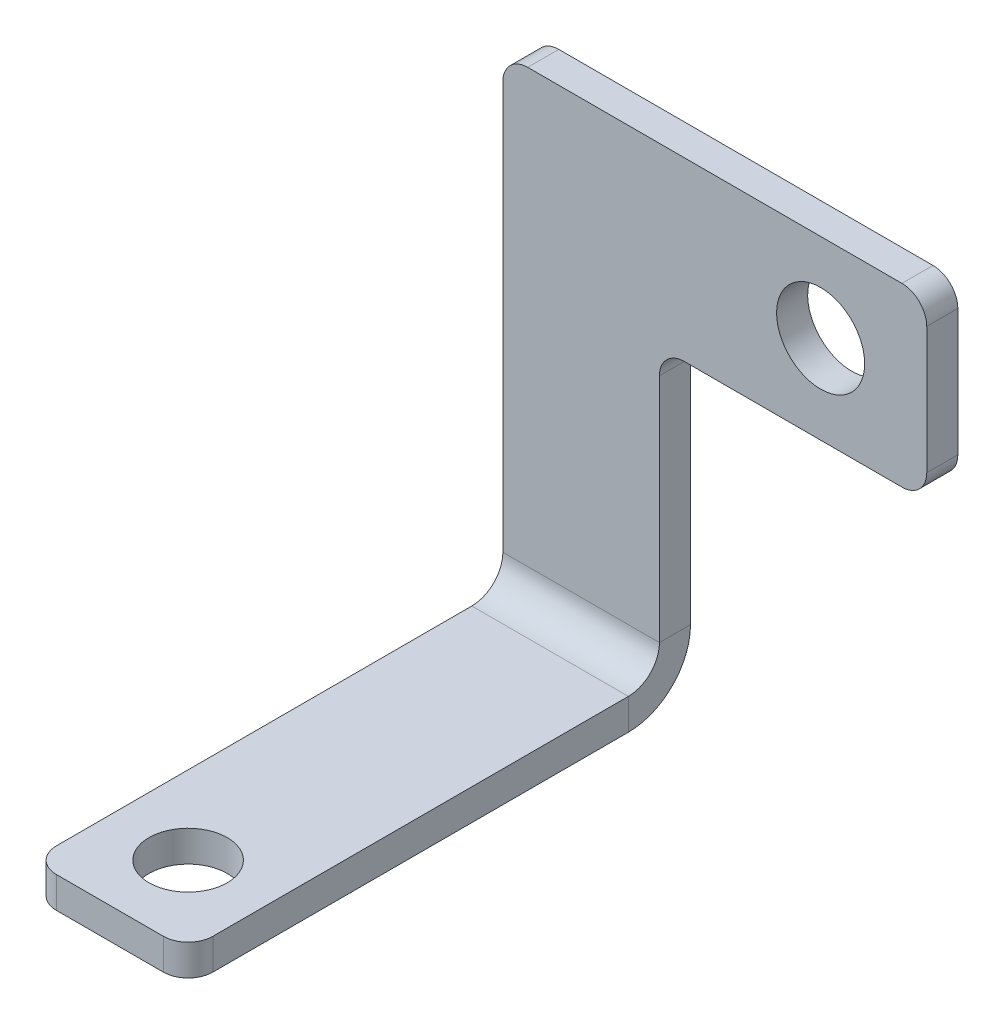
ISO-10303-21;
HEADER;
FILE_DESCRIPTION(('STEP AP214'),'2;1');
FILE_NAME('part.step','',(''),(''),'','','');
FILE_SCHEMA(('AUTOMOTIVE_DESIGN { 1 0 10303 214 1 1 1 1 }'));
ENDSEC;
DATA;
#1=APPLICATION_CONTEXT('core data for automotive mechanical design processes');
#2=APPLICATION_PROTOCOL_DEFINITION('international standard','automotive_design',2000,#1);
#3=PRODUCT_CONTEXT('',#1,'mechanical');
#4=PRODUCT('Part','Part','',(#3));
#5=PRODUCT_RELATED_PRODUCT_CATEGORY('part','',(#4));
#6=PRODUCT_DEFINITION_FORMATION('','',#4);
#7=PRODUCT_DEFINITION_CONTEXT('part definition',#1,'design');
#8=PRODUCT_DEFINITION('design','',#6,#7);
#9=PRODUCT_DEFINITION_SHAPE('','',#8);
#10=(LENGTH_UNIT() NAMED_UNIT(*) SI_UNIT(.MILLI.,.METRE.));
#11=(NAMED_UNIT(*) PLANE_ANGLE_UNIT() SI_UNIT($,.RADIAN.));
#12=(NAMED_UNIT(*) SI_UNIT($,.STERADIAN.) SOLID_ANGLE_UNIT());
#13=UNCERTAINTY_MEASURE_WITH_UNIT(LENGTH_MEASURE(1.E-05),#10,'distance_accuracy_value','');
#14=(GEOMETRIC_REPRESENTATION_CONTEXT(3) GLOBAL_UNCERTAINTY_ASSIGNED_CONTEXT((#13)) GLOBAL_UNIT_ASSIGNED_CONTEXT((#10,
#11,#12)) REPRESENTATION_CONTEXT('',''));
#15=CARTESIAN_POINT('',(0.,0.,0.));
#16=DIRECTION('',(0.,0.,1.));
#17=DIRECTION('',(1.,0.,0.));
#18=AXIS2_PLACEMENT_3D('',#15,#16,#17);
#19=CARTESIAN_POINT('',(-8.,3.175,8.));
#20=DIRECTION('',(1.,0.,0.));
#21=DIRECTION('',(0.,0.,-1.));
#22=AXIS2_PLACEMENT_3D('',#19,#20,#21);
#23=PLANE('',#22);
#24=DIRECTION('',(0.,0.,1.));
#25=VECTOR('',#24,1.);
#26=CARTESIAN_POINT('',(-8.,0.,0.));
#27=LINE('',#26,#25);
#28=CARTESIAN_POINT('',(-8.,0.,5.46));
#29=VERTEX_POINT('',#28);
#30=CARTESIAN_POINT('',(-7.99999999999999,0.,-36.992640012));
#31=VERTEX_POINT('',#30);
#32=EDGE_CURVE('E256',#29,#31,#27,.F.);
#33=ORIENTED_EDGE('',*,*,#32,.F.);
#34=DIRECTION('',(0.,1.,0.));
#35=VECTOR('',#34,1.);
#36=CARTESIAN_POINT('',(-8.,3.175,5.46));
#37=LINE('',#36,#35);
#38=CARTESIAN_POINT('',(-8.,3.175,5.46));
#39=VERTEX_POINT('',#38);
#40=EDGE_CURVE('E252',#29,#39,#37,.T.);
#41=ORIENTED_EDGE('',*,*,#40,.T.);
#42=DIRECTION('',(0.,0.,-1.));
#43=VECTOR('',#42,1.);
#44=CARTESIAN_POINT('',(-8.,3.175,8.));
#45=LINE('',#44,#43);
#46=CARTESIAN_POINT('',(-8.,3.175,-36.992640012));
#47=VERTEX_POINT('',#46);
#48=EDGE_CURVE('E247',#39,#47,#45,.T.);
#49=ORIENTED_EDGE('',*,*,#48,.T.);
#50=DIRECTION('',(0.,-1.,0.));
#51=VECTOR('',#50,1.);
#52=CARTESIAN_POINT('',(-7.99999999999999,3.17499999999997,-36.992640012));
#53=LINE('',#52,#51);
#54=EDGE_CURVE('E227',#47,#31,#53,.T.);
#55=ORIENTED_EDGE('',*,*,#54,.T.);
#56=EDGE_LOOP('',(#33,#41,#49,#55));
#57=FACE_BOUND('',#56,.T.);
#58=ADVANCED_FACE('F53',(#57),#23,.F.);
#59=CARTESIAN_POINT('',(0.,3.175,0.));
#60=DIRECTION('',(0.,1.,0.));
#61=DIRECTION('',(0.,0.,1.));
#62=AXIS2_PLACEMENT_3D('',#59,#60,#61);
#63=PLANE('',#62);
#64=CARTESIAN_POINT('',(0.,3.175,0.));
#65=DIRECTION('',(0.,1.,0.));
#66=DIRECTION('',(0.,0.,1.));
#67=AXIS2_PLACEMENT_3D('',#64,#65,#66);
#68=CIRCLE('',#67,4.);
#69=CARTESIAN_POINT('',(0.,3.175,4.));
#70=VERTEX_POINT('',#69);
#71=EDGE_CURVE('E249',#70,#70,#68,.T.);
#72=ORIENTED_EDGE('',*,*,#71,.F.);
#73=EDGE_LOOP('',(#72));
#74=FACE_BOUND('',#73,.T.);
#75=ORIENTED_EDGE('',*,*,#48,.F.);
#76=CARTESIAN_POINT('',(-5.46,3.175,5.46));
#77=DIRECTION('',(0.,1.,0.));
#78=DIRECTION('',(0.,0.,1.));
#79=AXIS2_PLACEMENT_3D('',#76,#77,#78);
#80=CIRCLE('',#79,2.54);
#81=CARTESIAN_POINT('',(-5.46,3.175,8.));
#82=VERTEX_POINT('',#81);
#83=EDGE_CURVE('E265',#39,#82,#80,.T.);
#84=ORIENTED_EDGE('',*,*,#83,.T.);
#85=DIRECTION('',(1.,0.,0.));
#86=VECTOR('',#85,1.);
#87=CARTESIAN_POINT('',(-8.,3.175,8.));
#88=LINE('',#87,#86);
#89=CARTESIAN_POINT('',(5.46,3.175,8.));
#90=VERTEX_POINT('',#89);
#91=EDGE_CURVE('E241',#82,#90,#88,.T.);
#92=ORIENTED_EDGE('',*,*,#91,.T.);
#93=CARTESIAN_POINT('',(5.46,3.175,5.46));
#94=DIRECTION('',(0.,1.,0.));
#95=DIRECTION('',(0.,0.,1.));
#96=AXIS2_PLACEMENT_3D('',#93,#94,#95);
#97=CIRCLE('',#96,2.54);
#98=CARTESIAN_POINT('',(8.,3.175,5.46));
#99=VERTEX_POINT('',#98);
#100=EDGE_CURVE('E263',#90,#99,#97,.T.);
#101=ORIENTED_EDGE('',*,*,#100,.T.);
#102=DIRECTION('',(0.,0.,-1.));
#103=VECTOR('',#102,1.);
#104=CARTESIAN_POINT('',(8.,3.175,8.));
#105=LINE('',#104,#103);
#106=CARTESIAN_POINT('',(8.,3.175,-36.992640012));
#107=VERTEX_POINT('',#106);
#108=EDGE_CURVE('E244',#99,#107,#105,.T.);
#109=ORIENTED_EDGE('',*,*,#108,.T.);
#110=DIRECTION('',(-1.,0.,0.));
#111=VECTOR('',#110,1.);
#112=CARTESIAN_POINT('',(-8.,3.17499999999997,-36.992640012));
#113=LINE('',#112,#111);
#114=EDGE_CURVE('E231',#47,#107,#113,.F.);
#115=ORIENTED_EDGE('',*,*,#114,.F.);
#116=EDGE_LOOP('',(#75,#84,#92,#101,#109,#115));
#117=FACE_BOUND('',#116,.T.);
#118=ADVANCED_FACE('F348',(#74,#117),#63,.T.);
#119=CARTESIAN_POINT('',(0.,0.,0.));
#120=DIRECTION('',(0.,1.,0.));
#121=DIRECTION('',(0.,0.,1.));
#122=AXIS2_PLACEMENT_3D('',#119,#120,#121);
#123=PLANE('',#122);
#124=CARTESIAN_POINT('',(0.,0.,0.));
#125=DIRECTION('',(0.,1.,0.));
#126=DIRECTION('',(0.,0.,1.));
#127=AXIS2_PLACEMENT_3D('',#124,#125,#126);
#128=CIRCLE('',#127,4.);
#129=CARTESIAN_POINT('',(0.,0.,4.));
#130=VERTEX_POINT('',#129);
#131=EDGE_CURVE('E245',#130,#130,#128,.T.);
#132=ORIENTED_EDGE('',*,*,#131,.T.);
#133=EDGE_LOOP('',(#132));
#134=FACE_BOUND('',#133,.T.);
#135=DIRECTION('',(1.,0.,0.));
#136=VECTOR('',#135,1.);
#137=CARTESIAN_POINT('',(0.,0.,8.));
#138=LINE('',#137,#136);
#139=CARTESIAN_POINT('',(-5.46,0.,8.));
#140=VERTEX_POINT('',#139);
#141=CARTESIAN_POINT('',(5.46,0.,8.));
#142=VERTEX_POINT('',#141);
#143=EDGE_CURVE('E238',#140,#142,#138,.T.);
#144=ORIENTED_EDGE('',*,*,#143,.F.);
#145=CARTESIAN_POINT('',(-5.46,0.,5.46));
#146=DIRECTION('',(0.,1.,0.));
#147=DIRECTION('',(0.,0.,1.));
#148=AXIS2_PLACEMENT_3D('',#145,#146,#147);
#149=CIRCLE('',#148,2.54);
#150=EDGE_CURVE('E274',#140,#29,#149,.F.);
#151=ORIENTED_EDGE('',*,*,#150,.T.);
#152=ORIENTED_EDGE('',*,*,#32,.T.);
#153=DIRECTION('',(-1.,0.,0.));
#154=VECTOR('',#153,1.);
#155=CARTESIAN_POINT('',(-8.,0.,-36.992640012));
#156=LINE('',#155,#154);
#157=CARTESIAN_POINT('',(8.,0.,-36.992640012));
#158=VERTEX_POINT('',#157);
#159=EDGE_CURVE('E175',#31,#158,#156,.F.);
#160=ORIENTED_EDGE('',*,*,#159,.T.);
#161=DIRECTION('',(0.,0.,1.));
#162=VECTOR('',#161,1.);
#163=CARTESIAN_POINT('',(8.,0.,0.));
#164=LINE('',#163,#162);
#165=CARTESIAN_POINT('',(8.,0.,5.46));
#166=VERTEX_POINT('',#165);
#167=EDGE_CURVE('E255',#166,#158,#164,.F.);
#168=ORIENTED_EDGE('',*,*,#167,.F.);
#169=CARTESIAN_POINT('',(5.46,0.,5.46));
#170=DIRECTION('',(0.,1.,0.));
#171=DIRECTION('',(0.,0.,1.));
#172=AXIS2_PLACEMENT_3D('',#169,#170,#171);
#173=CIRCLE('',#172,2.54);
#174=EDGE_CURVE('E272',#166,#142,#173,.F.);
#175=ORIENTED_EDGE('',*,*,#174,.T.);
#176=EDGE_LOOP('',(#144,#151,#152,#160,#168,#175));
#177=FACE_BOUND('',#176,.T.);
#178=ADVANCED_FACE('F355',(#134,#177),#123,.F.);
#179=CARTESIAN_POINT('',(-8.,3.175,8.));
#180=DIRECTION('',(0.,0.,1.));
#181=DIRECTION('',(1.,0.,0.));
#182=AXIS2_PLACEMENT_3D('',#179,#180,#181);
#183=PLANE('',#182);
#184=ORIENTED_EDGE('',*,*,#91,.F.);
#185=DIRECTION('',(0.,-1.,0.));
#186=VECTOR('',#185,1.);
#187=CARTESIAN_POINT('',(-5.46,3.175,8.));
#188=LINE('',#187,#186);
#189=EDGE_CURVE('E270',#82,#140,#188,.T.);
#190=ORIENTED_EDGE('',*,*,#189,.T.);
#191=ORIENTED_EDGE('',*,*,#143,.T.);
#192=DIRECTION('',(0.,1.,0.));
#193=VECTOR('',#192,1.);
#194=CARTESIAN_POINT('',(5.46,3.175,8.));
#195=LINE('',#194,#193);
#196=EDGE_CURVE('E267',#142,#90,#195,.T.);
#197=ORIENTED_EDGE('',*,*,#196,.T.);
#198=EDGE_LOOP('',(#184,#190,#191,#197));
#199=FACE_BOUND('',#198,.T.);
#200=ADVANCED_FACE('F361',(#199),#183,.T.);
#201=CARTESIAN_POINT('',(8.,3.175,8.));
#202=DIRECTION('',(1.,0.,0.));
#203=DIRECTION('',(0.,0.,-1.));
#204=AXIS2_PLACEMENT_3D('',#201,#202,#203);
#205=PLANE('',#204);
#206=ORIENTED_EDGE('',*,*,#108,.F.);
#207=DIRECTION('',(0.,1.,0.));
#208=VECTOR('',#207,1.);
#209=CARTESIAN_POINT('',(8.,3.175,5.46));
#210=LINE('',#209,#208);
#211=EDGE_CURVE('E276',#99,#166,#210,.F.);
#212=ORIENTED_EDGE('',*,*,#211,.T.);
#213=ORIENTED_EDGE('',*,*,#167,.T.);
#214=DIRECTION('',(0.,-1.,0.));
#215=VECTOR('',#214,1.);
#216=CARTESIAN_POINT('',(8.,3.17499999999997,-36.992640012));
#217=LINE('',#216,#215);
#218=EDGE_CURVE('E235',#107,#158,#217,.T.);
#219=ORIENTED_EDGE('',*,*,#218,.F.);
#220=EDGE_LOOP('',(#206,#212,#213,#219));
#221=FACE_BOUND('',#220,.T.);
#222=ADVANCED_FACE('F363',(#221),#205,.T.);
#223=CARTESIAN_POINT('',(0.,3.175,0.));
#224=DIRECTION('',(0.,1.,0.));
#225=DIRECTION('',(0.,0.,1.));
#226=AXIS2_PLACEMENT_3D('',#223,#224,#225);
#227=CYLINDRICAL_SURFACE('',#226,4.);
#228=ORIENTED_EDGE('',*,*,#71,.T.);
#229=EDGE_LOOP('',(#228));
#230=FACE_BOUND('',#229,.T.);
#231=ORIENTED_EDGE('',*,*,#131,.F.);
#232=EDGE_LOOP('',(#231));
#233=FACE_BOUND('',#232,.T.);
#234=ADVANCED_FACE('F366',(#230,#233),#227,.F.);
#235=CARTESIAN_POINT('',(8.,6.34999999999997,-36.992640012));
#236=DIRECTION('',(1.,0.,0.));
#237=DIRECTION('',(0.,0.,-1.));
#238=AXIS2_PLACEMENT_3D('',#235,#236,#237);
#239=PLANE('',#238);
#240=DIRECTION('',(0.,0.,-1.));
#241=VECTOR('',#240,1.);
#242=CARTESIAN_POINT('',(8.,6.34999999999999,-40.167640012));
#243=LINE('',#242,#241);
#244=CARTESIAN_POINT('',(8.,6.34999999999995,-40.167640012));
#245=VERTEX_POINT('',#244);
#246=CARTESIAN_POINT('',(8.,6.34999999999994,-43.342640012));
#247=VERTEX_POINT('',#246);
#248=EDGE_CURVE('E322',#245,#247,#243,.T.);
#249=ORIENTED_EDGE('',*,*,#248,.F.);
#250=CARTESIAN_POINT('',(8.,6.34999999999997,-36.992640012));
#251=DIRECTION('',(-1.,0.,0.));
#252=DIRECTION('',(0.,0.,1.));
#253=AXIS2_PLACEMENT_3D('',#250,#251,#252);
#254=CIRCLE('',#253,3.175);
#255=EDGE_CURVE('E178',#107,#245,#254,.F.);
#256=ORIENTED_EDGE('',*,*,#255,.F.);
#257=ORIENTED_EDGE('',*,*,#218,.T.);
#258=CARTESIAN_POINT('',(8.,6.34999999999997,-36.992640012));
#259=DIRECTION('',(-1.,0.,0.));
#260=DIRECTION('',(0.,0.,1.));
#261=AXIS2_PLACEMENT_3D('',#258,#259,#260);
#262=CIRCLE('',#261,6.35);
#263=EDGE_CURVE('E226',#158,#247,#262,.F.);
#264=ORIENTED_EDGE('',*,*,#263,.T.);
#265=EDGE_LOOP('',(#249,#256,#257,#264));
#266=FACE_BOUND('',#265,.T.);
#267=ADVANCED_FACE('F370',(#266),#239,.T.);
#268=CARTESIAN_POINT('',(-7.99999999999999,6.34999999999997,-36.992640012));
#269=DIRECTION('',(1.,0.,0.));
#270=DIRECTION('',(0.,0.,-1.));
#271=AXIS2_PLACEMENT_3D('',#268,#269,#270);
#272=PLANE('',#271);
#273=CARTESIAN_POINT('',(-7.99999999999999,6.34999999999997,-36.992640012));
#274=DIRECTION('',(-1.,0.,0.));
#275=DIRECTION('',(0.,0.,1.));
#276=AXIS2_PLACEMENT_3D('',#273,#274,#275);
#277=CIRCLE('',#276,3.175);
#278=CARTESIAN_POINT('',(-7.99999999999999,6.34999999999995,-40.167640012));
#279=VERTEX_POINT('',#278);
#280=EDGE_CURVE('E185',#279,#47,#277,.T.);
#281=ORIENTED_EDGE('',*,*,#280,.F.);
#282=DIRECTION('',(0.,0.,-1.));
#283=VECTOR('',#282,1.);
#284=CARTESIAN_POINT('',(-7.99999999999999,6.34999999999999,-40.167640012));
#285=LINE('',#284,#283);
#286=CARTESIAN_POINT('',(-7.99999999999999,6.35000000000001,-43.342640012));
#287=VERTEX_POINT('',#286);
#288=EDGE_CURVE('E182',#279,#287,#285,.T.);
#289=ORIENTED_EDGE('',*,*,#288,.T.);
#290=CARTESIAN_POINT('',(-7.99999999999999,6.34999999999997,-36.992640012));
#291=DIRECTION('',(-1.,0.,0.));
#292=DIRECTION('',(0.,0.,1.));
#293=AXIS2_PLACEMENT_3D('',#290,#291,#292);
#294=CIRCLE('',#293,6.35);
#295=EDGE_CURVE('E167',#287,#31,#294,.T.);
#296=ORIENTED_EDGE('',*,*,#295,.T.);
#297=ORIENTED_EDGE('',*,*,#54,.F.);
#298=EDGE_LOOP('',(#281,#289,#296,#297));
#299=FACE_BOUND('',#298,.T.);
#300=ADVANCED_FACE('F183',(#299),#272,.F.);
#301=CARTESIAN_POINT('',(-8.,6.34999999999997,-36.992640012));
#302=DIRECTION('',(-1.,0.,0.));
#303=DIRECTION('',(0.,0.,-1.));
#304=AXIS2_PLACEMENT_3D('',#301,#302,#303);
#305=CYLINDRICAL_SURFACE('',#304,6.35);
#306=ORIENTED_EDGE('',*,*,#159,.F.);
#307=ORIENTED_EDGE('',*,*,#295,.F.);
#308=DIRECTION('',(1.,0.,0.));
#309=VECTOR('',#308,1.);
#310=CARTESIAN_POINT('',(0.,6.35000000000001,-43.342640012));
#311=LINE('',#310,#309);
#312=EDGE_CURVE('E172',#287,#247,#311,.T.);
#313=ORIENTED_EDGE('',*,*,#312,.T.);
#314=ORIENTED_EDGE('',*,*,#263,.F.);
#315=EDGE_LOOP('',(#306,#307,#313,#314));
#316=FACE_BOUND('',#315,.T.);
#317=ADVANCED_FACE('F169',(#316),#305,.T.);
#318=CARTESIAN_POINT('',(-8.,6.34999999999997,-36.992640012));
#319=DIRECTION('',(-1.,0.,0.));
#320=DIRECTION('',(0.,0.,-1.));
#321=AXIS2_PLACEMENT_3D('',#318,#319,#320);
#322=CYLINDRICAL_SURFACE('',#321,3.175);
#323=ORIENTED_EDGE('',*,*,#114,.T.);
#324=ORIENTED_EDGE('',*,*,#255,.T.);
#325=DIRECTION('',(-1.,0.,0.));
#326=VECTOR('',#325,1.);
#327=CARTESIAN_POINT('',(8.,6.34999999999999,-40.167640012));
#328=LINE('',#327,#326);
#329=EDGE_CURVE('E190',#245,#279,#328,.T.);
#330=ORIENTED_EDGE('',*,*,#329,.T.);
#331=ORIENTED_EDGE('',*,*,#280,.T.);
#332=EDGE_LOOP('',(#323,#324,#330,#331));
#333=FACE_BOUND('',#332,.T.);
#334=ADVANCED_FACE('F405',(#333),#322,.F.);
#335=CARTESIAN_POINT('',(-7.99999999999999,50.534,-43.3426400120002));
#336=DIRECTION('',(1.,0.,0.));
#337=DIRECTION('',(0.,1.,0.));
#338=AXIS2_PLACEMENT_3D('',#335,#336,#337);
#339=PLANE('',#338);
#340=DIRECTION('',(0.,1.,0.));
#341=VECTOR('',#340,1.);
#342=CARTESIAN_POINT('',(-7.99999999999999,50.534,-40.1676400120002));
#343=LINE('',#342,#341);
#344=CARTESIAN_POINT('',(-7.99999999999999,47.994,-40.1676400120002));
#345=VERTEX_POINT('',#344);
#346=EDGE_CURVE('E197',#279,#345,#343,.T.);
#347=ORIENTED_EDGE('',*,*,#346,.T.);
#348=DIRECTION('',(0.,0.,1.));
#349=VECTOR('',#348,1.);
#350=CARTESIAN_POINT('',(-7.99999999999999,47.994,-43.3426400120002));
#351=LINE('',#350,#349);
#352=CARTESIAN_POINT('',(-7.99999999999999,47.994,-43.3426400120002));
#353=VERTEX_POINT('',#352);
#354=EDGE_CURVE('E201',#345,#353,#351,.F.);
#355=ORIENTED_EDGE('',*,*,#354,.T.);
#356=DIRECTION('',(0.,1.,0.));
#357=VECTOR('',#356,1.);
#358=CARTESIAN_POINT('',(-7.99999999999999,50.534,-43.3426400120002));
#359=LINE('',#358,#357);
#360=EDGE_CURVE('E194',#287,#353,#359,.T.);
#361=ORIENTED_EDGE('',*,*,#360,.F.);
#362=ORIENTED_EDGE('',*,*,#288,.F.);
#363=EDGE_LOOP('',(#347,#355,#361,#362));
#364=FACE_BOUND('',#363,.T.);
#365=ADVANCED_FACE('F199',(#364),#339,.F.);
#366=CARTESIAN_POINT('',(8.,3.17499999999999,-43.342640012));
#367=DIRECTION('',(-1.,0.,0.));
#368=DIRECTION('',(0.,0.,1.));
#369=AXIS2_PLACEMENT_3D('',#366,#367,#368);
#370=PLANE('',#369);
#371=DIRECTION('',(0.,-1.,0.));
#372=VECTOR('',#371,1.);
#373=CARTESIAN_POINT('',(8.,3.17499999999999,-43.342640012));
#374=LINE('',#373,#372);
#375=CARTESIAN_POINT('',(8.,29.96,-43.3426400120001));
#376=VERTEX_POINT('',#375);
#377=EDGE_CURVE('E196',#376,#247,#374,.T.);
#378=ORIENTED_EDGE('',*,*,#377,.F.);
#379=DIRECTION('',(0.,0.,1.));
#380=VECTOR('',#379,1.);
#381=CARTESIAN_POINT('',(8.,29.96,-40.1676400120001));
#382=LINE('',#381,#380);
#383=CARTESIAN_POINT('',(8.,29.96,-40.1676400120001));
#384=VERTEX_POINT('',#383);
#385=EDGE_CURVE('E296',#376,#384,#382,.T.);
#386=ORIENTED_EDGE('',*,*,#385,.T.);
#387=DIRECTION('',(0.,-1.,0.));
#388=VECTOR('',#387,1.);
#389=CARTESIAN_POINT('',(8.,3.175,-40.167640012));
#390=LINE('',#389,#388);
#391=EDGE_CURVE('E203',#384,#245,#390,.T.);
#392=ORIENTED_EDGE('',*,*,#391,.T.);
#393=ORIENTED_EDGE('',*,*,#248,.T.);
#394=EDGE_LOOP('',(#378,#386,#392,#393));
#395=FACE_BOUND('',#394,.T.);
#396=ADVANCED_FACE('F319',(#395),#370,.F.);
#397=CARTESIAN_POINT('',(0.,-1.52331168277043E-13,-43.342640012));
#398=DIRECTION('',(0.,0.,1.));
#399=DIRECTION('',(0.,-1.,0.));
#400=AXIS2_PLACEMENT_3D('',#397,#398,#399);
#401=PLANE('',#400);
#402=CARTESIAN_POINT('',(24.4742,41.517,-43.3426400120001));
#403=DIRECTION('',(0.,0.,-1.));
#404=DIRECTION('',(0.,1.,0.));
#405=AXIS2_PLACEMENT_3D('',#402,#403,#404);
#406=CIRCLE('',#405,4.5);
#407=CARTESIAN_POINT('',(24.4742,46.017,-43.3426400120001));
#408=VERTEX_POINT('',#407);
#409=EDGE_CURVE('E328',#408,#408,#406,.T.);
#410=ORIENTED_EDGE('',*,*,#409,.F.);
#411=EDGE_LOOP('',(#410));
#412=FACE_BOUND('',#411,.T.);
#413=ORIENTED_EDGE('',*,*,#360,.T.);
#414=CARTESIAN_POINT('',(-5.46,47.994,-43.3426400120001));
#415=DIRECTION('',(0.,0.,1.));
#416=DIRECTION('',(0.,-1.,0.));
#417=AXIS2_PLACEMENT_3D('',#414,#415,#416);
#418=CIRCLE('',#417,2.54);
#419=CARTESIAN_POINT('',(-5.45999999999999,50.534,-43.3426400120002));
#420=VERTEX_POINT('',#419);
#421=EDGE_CURVE('E294',#353,#420,#418,.F.);
#422=ORIENTED_EDGE('',*,*,#421,.T.);
#423=DIRECTION('',(1.,0.,0.));
#424=VECTOR('',#423,1.);
#425=CARTESIAN_POINT('',(8.,50.534,-43.3426400120002));
#426=LINE('',#425,#424);
#427=CARTESIAN_POINT('',(32.78,50.534,-43.3426400120002));
#428=VERTEX_POINT('',#427);
#429=EDGE_CURVE('E202',#420,#428,#426,.T.);
#430=ORIENTED_EDGE('',*,*,#429,.T.);
#431=CARTESIAN_POINT('',(32.78,47.994,-43.3426400120001));
#432=DIRECTION('',(0.,0.,1.));
#433=DIRECTION('',(0.,-1.,0.));
#434=AXIS2_PLACEMENT_3D('',#431,#432,#433);
#435=CIRCLE('',#434,2.54);
#436=CARTESIAN_POINT('',(35.32,47.994,-43.3426400120002));
#437=VERTEX_POINT('',#436);
#438=EDGE_CURVE('E292',#428,#437,#435,.F.);
#439=ORIENTED_EDGE('',*,*,#438,.T.);
#440=DIRECTION('',(0.,-1.,0.));
#441=VECTOR('',#440,1.);
#442=CARTESIAN_POINT('',(35.32,50.534,-43.3426400120002));
#443=LINE('',#442,#441);
#444=CARTESIAN_POINT('',(35.32,35.04,-43.3426400120001));
#445=VERTEX_POINT('',#444);
#446=EDGE_CURVE('E206',#437,#445,#443,.T.);
#447=ORIENTED_EDGE('',*,*,#446,.T.);
#448=CARTESIAN_POINT('',(32.78,35.04,-43.3426400120001));
#449=DIRECTION('',(0.,0.,1.));
#450=DIRECTION('',(0.,-1.,0.));
#451=AXIS2_PLACEMENT_3D('',#448,#449,#450);
#452=CIRCLE('',#451,2.54);
#453=CARTESIAN_POINT('',(32.78,32.5,-43.3426400120001));
#454=VERTEX_POINT('',#453);
#455=EDGE_CURVE('E290',#445,#454,#452,.F.);
#456=ORIENTED_EDGE('',*,*,#455,.T.);
#457=DIRECTION('',(-1.,0.,0.));
#458=VECTOR('',#457,1.);
#459=CARTESIAN_POINT('',(35.32,32.5,-43.3426400120001));
#460=LINE('',#459,#458);
#461=CARTESIAN_POINT('',(10.54,32.5,-43.3426400120001));
#462=VERTEX_POINT('',#461);
#463=EDGE_CURVE('E214',#454,#462,#460,.T.);
#464=ORIENTED_EDGE('',*,*,#463,.T.);
#465=CARTESIAN_POINT('',(10.54,29.96,-43.3426400120001));
#466=DIRECTION('',(0.,0.,1.));
#467=DIRECTION('',(0.,-1.,0.));
#468=AXIS2_PLACEMENT_3D('',#465,#466,#467);
#469=CIRCLE('',#468,2.54);
#470=EDGE_CURVE('E12',#462,#376,#469,.T.);
#471=ORIENTED_EDGE('',*,*,#470,.T.);
#472=ORIENTED_EDGE('',*,*,#377,.T.);
#473=ORIENTED_EDGE('',*,*,#312,.F.);
#474=EDGE_LOOP('',(#413,#422,#430,#439,#447,#456,#464,#471,#472,#473));
#475=FACE_BOUND('',#474,.T.);
#476=ADVANCED_FACE('F193',(#412,#475),#401,.F.);
#477=CARTESIAN_POINT('',(0.,-1.41245715026216E-13,-40.167640012));
#478=DIRECTION('',(0.,0.,1.));
#479=DIRECTION('',(0.,-1.,0.));
#480=AXIS2_PLACEMENT_3D('',#477,#478,#479);
#481=PLANE('',#480);
#482=CARTESIAN_POINT('',(24.4742,41.517,-40.1676400120001));
#483=DIRECTION('',(0.,0.,1.));
#484=DIRECTION('',(0.,-1.,0.));
#485=AXIS2_PLACEMENT_3D('',#482,#483,#484);
#486=CIRCLE('',#485,4.5);
#487=CARTESIAN_POINT('',(24.4742,37.017,-40.1676400120001));
#488=VERTEX_POINT('',#487);
#489=EDGE_CURVE('E325',#488,#488,#486,.T.);
#490=ORIENTED_EDGE('',*,*,#489,.F.);
#491=EDGE_LOOP('',(#490));
#492=FACE_BOUND('',#491,.T.);
#493=DIRECTION('',(1.,0.,0.));
#494=VECTOR('',#493,1.);
#495=CARTESIAN_POINT('',(27.7,50.534,-40.1676400120002));
#496=LINE('',#495,#494);
#497=CARTESIAN_POINT('',(-5.45999999999999,50.534,-40.1676400120002));
#498=VERTEX_POINT('',#497);
#499=CARTESIAN_POINT('',(32.78,50.534,-40.1676400120002));
#500=VERTEX_POINT('',#499);
#501=EDGE_CURVE('E218',#498,#500,#496,.T.);
#502=ORIENTED_EDGE('',*,*,#501,.F.);
#503=CARTESIAN_POINT('',(-5.46,47.994,-40.1676400120001));
#504=DIRECTION('',(0.,0.,1.));
#505=DIRECTION('',(0.,-1.,0.));
#506=AXIS2_PLACEMENT_3D('',#503,#504,#505);
#507=CIRCLE('',#506,2.54);
#508=EDGE_CURVE('E287',#498,#345,#507,.T.);
#509=ORIENTED_EDGE('',*,*,#508,.T.);
#510=ORIENTED_EDGE('',*,*,#346,.F.);
#511=ORIENTED_EDGE('',*,*,#329,.F.);
#512=ORIENTED_EDGE('',*,*,#391,.F.);
#513=CARTESIAN_POINT('',(10.54,29.96,-40.1676400120001));
#514=DIRECTION('',(0.,0.,1.));
#515=DIRECTION('',(0.,-1.,0.));
#516=AXIS2_PLACEMENT_3D('',#513,#514,#515);
#517=CIRCLE('',#516,2.54);
#518=CARTESIAN_POINT('',(10.54,32.5,-40.1676400120001));
#519=VERTEX_POINT('',#518);
#520=EDGE_CURVE('E61',#384,#519,#517,.F.);
#521=ORIENTED_EDGE('',*,*,#520,.T.);
#522=DIRECTION('',(-1.,0.,0.));
#523=VECTOR('',#522,1.);
#524=CARTESIAN_POINT('',(27.7,32.5,-40.1676400120001));
#525=LINE('',#524,#523);
#526=CARTESIAN_POINT('',(32.78,32.5,-40.1676400120001));
#527=VERTEX_POINT('',#526);
#528=EDGE_CURVE('E208',#527,#519,#525,.T.);
#529=ORIENTED_EDGE('',*,*,#528,.F.);
#530=CARTESIAN_POINT('',(32.78,35.04,-40.1676400120001));
#531=DIRECTION('',(0.,0.,1.));
#532=DIRECTION('',(0.,-1.,0.));
#533=AXIS2_PLACEMENT_3D('',#530,#531,#532);
#534=CIRCLE('',#533,2.54);
#535=CARTESIAN_POINT('',(35.32,35.04,-40.1676400120001));
#536=VERTEX_POINT('',#535);
#537=EDGE_CURVE('E283',#527,#536,#534,.T.);
#538=ORIENTED_EDGE('',*,*,#537,.T.);
#539=DIRECTION('',(0.,-1.,0.));
#540=VECTOR('',#539,1.);
#541=CARTESIAN_POINT('',(35.32,50.534,-40.1676400120002));
#542=LINE('',#541,#540);
#543=CARTESIAN_POINT('',(35.32,47.994,-40.1676400120002));
#544=VERTEX_POINT('',#543);
#545=EDGE_CURVE('E221',#544,#536,#542,.T.);
#546=ORIENTED_EDGE('',*,*,#545,.F.);
#547=CARTESIAN_POINT('',(32.78,47.994,-40.1676400120001));
#548=DIRECTION('',(0.,0.,1.));
#549=DIRECTION('',(0.,-1.,0.));
#550=AXIS2_PLACEMENT_3D('',#547,#548,#549);
#551=CIRCLE('',#550,2.54);
#552=EDGE_CURVE('E285',#544,#500,#551,.T.);
#553=ORIENTED_EDGE('',*,*,#552,.T.);
#554=EDGE_LOOP('',(#502,#509,#510,#511,#512,#521,#529,#538,#546,#553));
#555=FACE_BOUND('',#554,.T.);
#556=ADVANCED_FACE('F311',(#492,#555),#481,.T.);
#557=CARTESIAN_POINT('',(27.7,50.534,-43.3426400120002));
#558=DIRECTION('',(0.,-1.,0.));
#559=DIRECTION('',(0.,0.,-1.));
#560=AXIS2_PLACEMENT_3D('',#557,#558,#559);
#561=PLANE('',#560);
#562=ORIENTED_EDGE('',*,*,#429,.F.);
#563=DIRECTION('',(0.,0.,1.));
#564=VECTOR('',#563,1.);
#565=CARTESIAN_POINT('',(-5.45999999999999,50.534,-43.3426400120002));
#566=LINE('',#565,#564);
#567=EDGE_CURVE('E280',#420,#498,#566,.T.);
#568=ORIENTED_EDGE('',*,*,#567,.T.);
#569=ORIENTED_EDGE('',*,*,#501,.T.);
#570=DIRECTION('',(0.,0.,1.));
#571=VECTOR('',#570,1.);
#572=CARTESIAN_POINT('',(32.78,50.534,-43.3426400120002));
#573=LINE('',#572,#571);
#574=EDGE_CURVE('E278',#500,#428,#573,.F.);
#575=ORIENTED_EDGE('',*,*,#574,.T.);
#576=EDGE_LOOP('',(#562,#568,#569,#575));
#577=FACE_BOUND('',#576,.T.);
#578=ADVANCED_FACE('F342',(#577),#561,.F.);
#579=CARTESIAN_POINT('',(35.32,50.534,-43.3426400120002));
#580=DIRECTION('',(-1.,0.,0.));
#581=DIRECTION('',(0.,0.,1.));
#582=AXIS2_PLACEMENT_3D('',#579,#580,#581);
#583=PLANE('',#582);
#584=ORIENTED_EDGE('',*,*,#446,.F.);
#585=DIRECTION('',(0.,0.,1.));
#586=VECTOR('',#585,1.);
#587=CARTESIAN_POINT('',(35.32,47.994,-43.3426400120002));
#588=LINE('',#587,#586);
#589=EDGE_CURVE('E305',#437,#544,#588,.T.);
#590=ORIENTED_EDGE('',*,*,#589,.T.);
#591=ORIENTED_EDGE('',*,*,#545,.T.);
#592=DIRECTION('',(0.,0.,1.));
#593=VECTOR('',#592,1.);
#594=CARTESIAN_POINT('',(35.32,35.04,-43.3426400120001));
#595=LINE('',#594,#593);
#596=EDGE_CURVE('E303',#536,#445,#595,.F.);
#597=ORIENTED_EDGE('',*,*,#596,.T.);
#598=EDGE_LOOP('',(#584,#590,#591,#597));
#599=FACE_BOUND('',#598,.T.);
#600=ADVANCED_FACE('F399',(#599),#583,.F.);
#601=CARTESIAN_POINT('',(27.7,32.5,-43.3426400120001));
#602=DIRECTION('',(0.,1.,0.));
#603=DIRECTION('',(0.,0.,1.));
#604=AXIS2_PLACEMENT_3D('',#601,#602,#603);
#605=PLANE('',#604);
#606=ORIENTED_EDGE('',*,*,#528,.T.);
#607=DIRECTION('',(0.,0.,1.));
#608=VECTOR('',#607,1.);
#609=CARTESIAN_POINT('',(10.54,32.5,-43.3426400120001));
#610=LINE('',#609,#608);
#611=EDGE_CURVE('E74',#519,#462,#610,.F.);
#612=ORIENTED_EDGE('',*,*,#611,.T.);
#613=ORIENTED_EDGE('',*,*,#463,.F.);
#614=DIRECTION('',(0.,0.,1.));
#615=VECTOR('',#614,1.);
#616=CARTESIAN_POINT('',(32.78,32.5,-43.3426400120001));
#617=LINE('',#616,#615);
#618=EDGE_CURVE('E299',#454,#527,#617,.T.);
#619=ORIENTED_EDGE('',*,*,#618,.T.);
#620=EDGE_LOOP('',(#606,#612,#613,#619));
#621=FACE_BOUND('',#620,.T.);
#622=ADVANCED_FACE('F315',(#621),#605,.F.);
#623=CARTESIAN_POINT('',(24.4742,41.517,-43.3426400120001));
#624=DIRECTION('',(0.,0.,-1.));
#625=DIRECTION('',(0.,1.,0.));
#626=AXIS2_PLACEMENT_3D('',#623,#624,#625);
#627=CYLINDRICAL_SURFACE('',#626,4.5);
#628=ORIENTED_EDGE('',*,*,#489,.T.);
#629=EDGE_LOOP('',(#628));
#630=FACE_BOUND('',#629,.T.);
#631=ORIENTED_EDGE('',*,*,#409,.T.);
#632=EDGE_LOOP('',(#631));
#633=FACE_BOUND('',#632,.T.);
#634=ADVANCED_FACE('F334',(#630,#633),#627,.F.);
#635=CARTESIAN_POINT('',(-5.46,3.175,5.46));
#636=DIRECTION('',(0.,-1.,0.));
#637=DIRECTION('',(0.,0.,-1.));
#638=AXIS2_PLACEMENT_3D('',#635,#636,#637);
#639=CYLINDRICAL_SURFACE('',#638,2.54);
#640=ORIENTED_EDGE('',*,*,#150,.F.);
#641=ORIENTED_EDGE('',*,*,#189,.F.);
#642=ORIENTED_EDGE('',*,*,#83,.F.);
#643=ORIENTED_EDGE('',*,*,#40,.F.);
#644=EDGE_LOOP('',(#640,#641,#642,#643));
#645=FACE_BOUND('',#644,.T.);
#646=ADVANCED_FACE('F372',(#645),#639,.T.);
#647=CARTESIAN_POINT('',(5.46,3.175,5.46));
#648=DIRECTION('',(0.,1.,0.));
#649=DIRECTION('',(0.,0.,1.));
#650=AXIS2_PLACEMENT_3D('',#647,#648,#649);
#651=CYLINDRICAL_SURFACE('',#650,2.54);
#652=ORIENTED_EDGE('',*,*,#174,.F.);
#653=ORIENTED_EDGE('',*,*,#211,.F.);
#654=ORIENTED_EDGE('',*,*,#100,.F.);
#655=ORIENTED_EDGE('',*,*,#196,.F.);
#656=EDGE_LOOP('',(#652,#653,#654,#655));
#657=FACE_BOUND('',#656,.T.);
#658=ADVANCED_FACE('F375',(#657),#651,.T.);
#659=CARTESIAN_POINT('',(-5.46,47.994,-43.3426400120002));
#660=DIRECTION('',(0.,0.,1.));
#661=DIRECTION('',(0.,-1.,0.));
#662=AXIS2_PLACEMENT_3D('',#659,#660,#661);
#663=CYLINDRICAL_SURFACE('',#662,2.54);
#664=ORIENTED_EDGE('',*,*,#421,.F.);
#665=ORIENTED_EDGE('',*,*,#354,.F.);
#666=ORIENTED_EDGE('',*,*,#508,.F.);
#667=ORIENTED_EDGE('',*,*,#567,.F.);
#668=EDGE_LOOP('',(#664,#665,#666,#667));
#669=FACE_BOUND('',#668,.T.);
#670=ADVANCED_FACE('F379',(#669),#663,.T.);
#671=CARTESIAN_POINT('',(10.54,29.96,-43.3426400120001));
#672=DIRECTION('',(0.,0.,-1.));
#673=DIRECTION('',(0.,1.,0.));
#674=AXIS2_PLACEMENT_3D('',#671,#672,#673);
#675=CYLINDRICAL_SURFACE('',#674,2.54);
#676=ORIENTED_EDGE('',*,*,#470,.F.);
#677=ORIENTED_EDGE('',*,*,#611,.F.);
#678=ORIENTED_EDGE('',*,*,#520,.F.);
#679=ORIENTED_EDGE('',*,*,#385,.F.);
#680=EDGE_LOOP('',(#676,#677,#678,#679));
#681=FACE_BOUND('',#680,.T.);
#682=ADVANCED_FACE('F317',(#681),#675,.F.);
#683=CARTESIAN_POINT('',(32.78,47.994,-43.3426400120002));
#684=DIRECTION('',(0.,0.,1.));
#685=DIRECTION('',(0.,-1.,0.));
#686=AXIS2_PLACEMENT_3D('',#683,#684,#685);
#687=CYLINDRICAL_SURFACE('',#686,2.54);
#688=ORIENTED_EDGE('',*,*,#438,.F.);
#689=ORIENTED_EDGE('',*,*,#574,.F.);
#690=ORIENTED_EDGE('',*,*,#552,.F.);
#691=ORIENTED_EDGE('',*,*,#589,.F.);
#692=EDGE_LOOP('',(#688,#689,#690,#691));
#693=FACE_BOUND('',#692,.T.);
#694=ADVANCED_FACE('F385',(#693),#687,.T.);
#695=CARTESIAN_POINT('',(32.78,35.04,-43.3426400120001));
#696=DIRECTION('',(0.,0.,1.));
#697=DIRECTION('',(0.,-1.,0.));
#698=AXIS2_PLACEMENT_3D('',#695,#696,#697);
#699=CYLINDRICAL_SURFACE('',#698,2.54);
#700=ORIENTED_EDGE('',*,*,#455,.F.);
#701=ORIENTED_EDGE('',*,*,#596,.F.);
#702=ORIENTED_EDGE('',*,*,#537,.F.);
#703=ORIENTED_EDGE('',*,*,#618,.F.);
#704=EDGE_LOOP('',(#700,#701,#702,#703));
#705=FACE_BOUND('',#704,.T.);
#706=ADVANCED_FACE('F55',(#705),#699,.T.);
#707=CLOSED_SHELL('',(#58,#118,#178,#200,#222,#234,#267,#300,#317,#334,#365,#396,#476,#556,#578,
#600,#622,#634,#646,#658,#670,#682,#694,#706));
#708=MANIFOLD_SOLID_BREP('B2',#707);
#709=ADVANCED_BREP_SHAPE_REPRESENTATION('',(#18,#708),#14);
#710=SHAPE_DEFINITION_REPRESENTATION(#9,#709);
ENDSEC;
END-ISO-10303-21;
